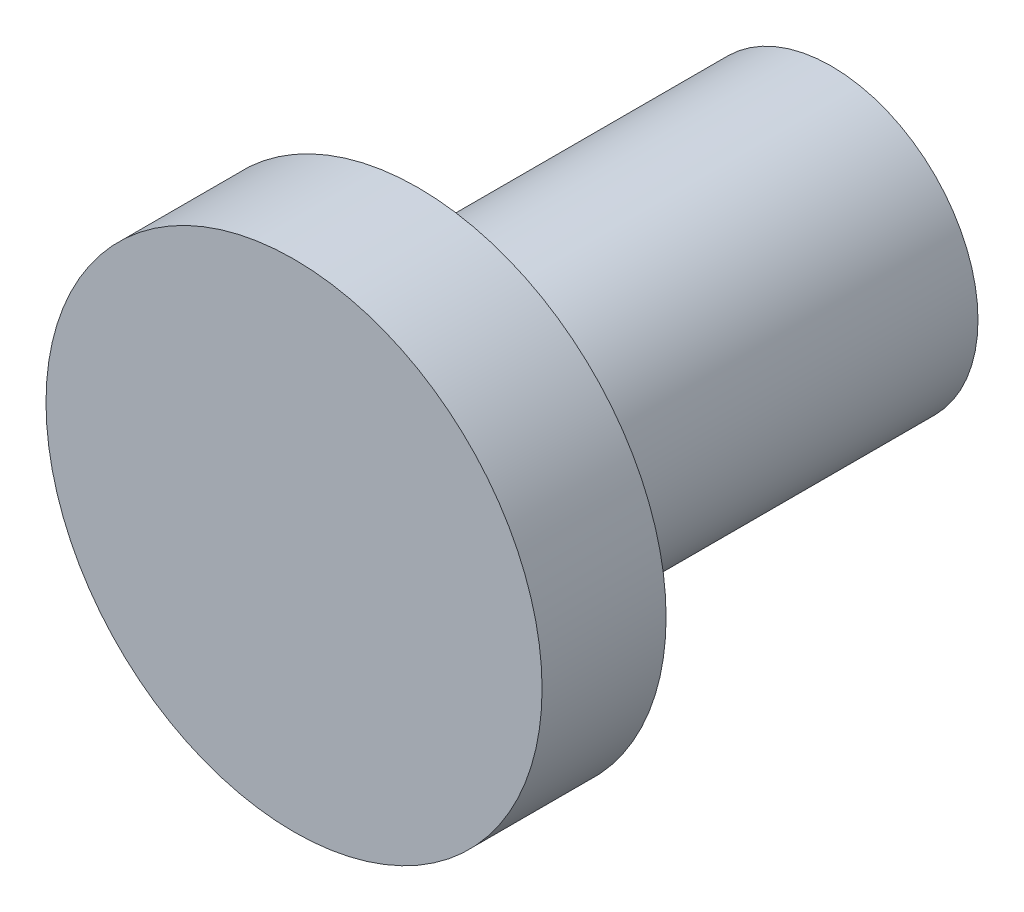
ISO-10303-21;
HEADER;
FILE_DESCRIPTION(('STEP AP214'),'2;1');
FILE_NAME('part.step','',(''),(''),'','','');
FILE_SCHEMA(('AUTOMOTIVE_DESIGN { 1 0 10303 214 1 1 1 1 }'));
ENDSEC;
DATA;
#1=APPLICATION_CONTEXT('core data for automotive mechanical design processes');
#2=APPLICATION_PROTOCOL_DEFINITION('international standard','automotive_design',2000,#1);
#3=PRODUCT_CONTEXT('',#1,'mechanical');
#4=PRODUCT('Part','Part','',(#3));
#5=PRODUCT_RELATED_PRODUCT_CATEGORY('part','',(#4));
#6=PRODUCT_DEFINITION_FORMATION('','',#4);
#7=PRODUCT_DEFINITION_CONTEXT('part definition',#1,'design');
#8=PRODUCT_DEFINITION('design','',#6,#7);
#9=PRODUCT_DEFINITION_SHAPE('','',#8);
#10=(LENGTH_UNIT() NAMED_UNIT(*) SI_UNIT(.MILLI.,.METRE.));
#11=(NAMED_UNIT(*) PLANE_ANGLE_UNIT() SI_UNIT($,.RADIAN.));
#12=(NAMED_UNIT(*) SI_UNIT($,.STERADIAN.) SOLID_ANGLE_UNIT());
#13=UNCERTAINTY_MEASURE_WITH_UNIT(LENGTH_MEASURE(1.E-05),#10,'distance_accuracy_value','');
#14=(GEOMETRIC_REPRESENTATION_CONTEXT(3) GLOBAL_UNCERTAINTY_ASSIGNED_CONTEXT((#13)) GLOBAL_UNIT_ASSIGNED_CONTEXT((#10,
#11,#12)) REPRESENTATION_CONTEXT('',''));
#15=CARTESIAN_POINT('',(0.,0.,0.));
#16=DIRECTION('',(0.,0.,1.));
#17=DIRECTION('',(1.,0.,0.));
#18=AXIS2_PLACEMENT_3D('',#15,#16,#17);
#19=CARTESIAN_POINT('',(389.255,317.5,-169.343834653373));
#20=DIRECTION('',(0.,0.,-1.));
#21=DIRECTION('',(-1.,0.,0.));
#22=AXIS2_PLACEMENT_3D('',#19,#20,#21);
#23=CYLINDRICAL_SURFACE('',#22,22.5099586096639);
#24=CARTESIAN_POINT('',(389.255,317.5,-169.343834653373));
#25=DIRECTION('',(0.,0.,1.));
#26=DIRECTION('',(1.,0.,0.));
#27=AXIS2_PLACEMENT_3D('',#24,#25,#26);
#28=CIRCLE('',#27,22.5099586096639);
#29=CARTESIAN_POINT('',(411.764958609664,317.5,-169.343834653373));
#30=VERTEX_POINT('',#29);
#31=EDGE_CURVE('E10',#30,#30,#28,.T.);
#32=ORIENTED_EDGE('',*,*,#31,.F.);
#33=EDGE_LOOP('',(#32));
#34=FACE_BOUND('',#33,.T.);
#35=CARTESIAN_POINT('',(389.255,317.5,-232.843834653373));
#36=DIRECTION('',(0.,0.,1.));
#37=DIRECTION('',(1.,0.,0.));
#38=AXIS2_PLACEMENT_3D('',#35,#36,#37);
#39=CIRCLE('',#38,22.5099586096639);
#40=CARTESIAN_POINT('',(411.764958609664,317.5,-232.843834653373));
#41=VERTEX_POINT('',#40);
#42=EDGE_CURVE('E35',#41,#41,#39,.T.);
#43=ORIENTED_EDGE('',*,*,#42,.T.);
#44=EDGE_LOOP('',(#43));
#45=FACE_BOUND('',#44,.T.);
#46=ADVANCED_FACE('F32',(#34,#45),#23,.T.);
#47=CARTESIAN_POINT('',(389.255,317.5,-232.843834653373));
#48=DIRECTION('',(0.,0.,1.));
#49=DIRECTION('',(1.,0.,0.));
#50=AXIS2_PLACEMENT_3D('',#47,#48,#49);
#51=PLANE('',#50);
#52=ORIENTED_EDGE('',*,*,#42,.F.);
#53=EDGE_LOOP('',(#52));
#54=FACE_BOUND('',#53,.T.);
#55=ADVANCED_FACE('F55',(#54),#51,.F.);
#56=CARTESIAN_POINT('',(389.255,317.5,-150.293834653373));
#57=DIRECTION('',(0.,0.,-1.));
#58=DIRECTION('',(-1.,0.,0.));
#59=AXIS2_PLACEMENT_3D('',#56,#57,#58);
#60=CYLINDRICAL_SURFACE('',#59,38.1);
#61=CARTESIAN_POINT('',(389.255,317.5,-150.293834653373));
#62=DIRECTION('',(0.,0.,1.));
#63=DIRECTION('',(1.,0.,0.));
#64=AXIS2_PLACEMENT_3D('',#61,#62,#63);
#65=CIRCLE('',#64,38.1);
#66=CARTESIAN_POINT('',(351.155,317.5,-150.293834653373));
#67=VERTEX_POINT('',#66);
#68=EDGE_CURVE('E42',#67,#67,#65,.T.);
#69=CARTESIAN_POINT('',(389.255,317.5,-169.343834653373));
#70=DIRECTION('',(0.,0.,1.));
#71=DIRECTION('',(1.,0.,0.));
#72=AXIS2_PLACEMENT_3D('',#69,#70,#71);
#73=CIRCLE('',#72,38.1);
#74=CARTESIAN_POINT('',(351.155,317.5,-169.343834653373));
#75=VERTEX_POINT('',#74);
#76=EDGE_CURVE('E44',#75,#75,#73,.T.);
#77=CARTESIAN_POINT('',(351.155,317.5,-150.293834653373));
#78=CARTESIAN_POINT('',(351.155,317.5,-150.492272153373));
#79=CARTESIAN_POINT('',(351.155,317.5,-150.690709653373));
#80=CARTESIAN_POINT('',(351.155,317.5,-151.087584653373));
#81=CARTESIAN_POINT('',(351.155,317.5,-151.286022153373));
#82=CARTESIAN_POINT('',(351.155,317.5,-151.682897153373));
#83=CARTESIAN_POINT('',(351.155,317.5,-151.881334653373));
#84=CARTESIAN_POINT('',(351.155,317.5,-152.278209653373));
#85=CARTESIAN_POINT('',(351.155,317.5,-152.476647153373));
#86=CARTESIAN_POINT('',(351.155,317.5,-152.873522153373));
#87=CARTESIAN_POINT('',(351.155,317.5,-153.071959653373));
#88=CARTESIAN_POINT('',(351.155,317.5,-153.468834653373));
#89=CARTESIAN_POINT('',(351.155,317.5,-153.667272153373));
#90=CARTESIAN_POINT('',(351.155,317.5,-154.064147153373));
#91=CARTESIAN_POINT('',(351.155,317.5,-154.262584653373));
#92=CARTESIAN_POINT('',(351.155,317.5,-154.659459653373));
#93=CARTESIAN_POINT('',(351.155,317.5,-154.857897153373));
#94=CARTESIAN_POINT('',(351.155,317.5,-155.254772153373));
#95=CARTESIAN_POINT('',(351.155,317.5,-155.453209653373));
#96=CARTESIAN_POINT('',(351.155,317.5,-155.850084653373));
#97=CARTESIAN_POINT('',(351.155,317.5,-156.048522153373));
#98=CARTESIAN_POINT('',(351.155,317.5,-156.445397153373));
#99=CARTESIAN_POINT('',(351.155,317.5,-156.643834653373));
#100=CARTESIAN_POINT('',(351.155,317.5,-157.040709653373));
#101=CARTESIAN_POINT('',(351.155,317.5,-157.239147153373));
#102=CARTESIAN_POINT('',(351.155,317.5,-157.636022153373));
#103=CARTESIAN_POINT('',(351.155,317.5,-157.834459653373));
#104=CARTESIAN_POINT('',(351.155,317.5,-158.231334653373));
#105=CARTESIAN_POINT('',(351.155,317.5,-158.429772153373));
#106=CARTESIAN_POINT('',(351.155,317.5,-158.826647153373));
#107=CARTESIAN_POINT('',(351.155,317.5,-159.025084653373));
#108=CARTESIAN_POINT('',(351.155,317.5,-159.421959653373));
#109=CARTESIAN_POINT('',(351.155,317.5,-159.620397153373));
#110=CARTESIAN_POINT('',(351.155,317.5,-160.017272153373));
#111=CARTESIAN_POINT('',(351.155,317.5,-160.215709653373));
#112=CARTESIAN_POINT('',(351.155,317.5,-160.612584653373));
#113=CARTESIAN_POINT('',(351.155,317.5,-160.811022153373));
#114=CARTESIAN_POINT('',(351.155,317.5,-161.207897153373));
#115=CARTESIAN_POINT('',(351.155,317.5,-161.406334653373));
#116=CARTESIAN_POINT('',(351.155,317.5,-161.803209653373));
#117=CARTESIAN_POINT('',(351.155,317.5,-162.001647153373));
#118=CARTESIAN_POINT('',(351.155,317.5,-162.398522153373));
#119=CARTESIAN_POINT('',(351.155,317.5,-162.596959653373));
#120=CARTESIAN_POINT('',(351.155,317.5,-162.993834653373));
#121=CARTESIAN_POINT('',(351.155,317.5,-163.192272153373));
#122=CARTESIAN_POINT('',(351.155,317.5,-163.589147153373));
#123=CARTESIAN_POINT('',(351.155,317.5,-163.787584653373));
#124=CARTESIAN_POINT('',(351.155,317.5,-164.184459653373));
#125=CARTESIAN_POINT('',(351.155,317.5,-164.382897153373));
#126=CARTESIAN_POINT('',(351.155,317.5,-164.779772153373));
#127=CARTESIAN_POINT('',(351.155,317.5,-164.978209653373));
#128=CARTESIAN_POINT('',(351.155,317.5,-165.375084653373));
#129=CARTESIAN_POINT('',(351.155,317.5,-165.573522153373));
#130=CARTESIAN_POINT('',(351.155,317.5,-165.970397153373));
#131=CARTESIAN_POINT('',(351.155,317.5,-166.168834653373));
#132=CARTESIAN_POINT('',(351.155,317.5,-166.565709653373));
#133=CARTESIAN_POINT('',(351.155,317.5,-166.764147153373));
#134=CARTESIAN_POINT('',(351.155,317.5,-167.161022153373));
#135=CARTESIAN_POINT('',(351.155,317.5,-167.359459653373));
#136=CARTESIAN_POINT('',(351.155,317.5,-167.756334653373));
#137=CARTESIAN_POINT('',(351.155,317.5,-167.954772153373));
#138=CARTESIAN_POINT('',(351.155,317.5,-168.351647153373));
#139=CARTESIAN_POINT('',(351.155,317.5,-168.550084653373));
#140=CARTESIAN_POINT('',(351.155,317.5,-168.946959653373));
#141=CARTESIAN_POINT('',(351.155,317.5,-169.145397153373));
#142=CARTESIAN_POINT('',(351.155,317.5,-169.343834653373));
#143=B_SPLINE_CURVE_WITH_KNOTS('',3,(#77,#78,#79,#80,#81,#82,#83,#84,#85,#86,#87,#88,#89,#90,
#91,#92,#93,#94,#95,#96,#97,#98,#99,#100,#101,#102,#103,#104,#105,#106,#107,#108,#109,#110,#111,
#112,#113,#114,#115,#116,#117,#118,#119,#120,#121,#122,#123,#124,#125,#126,#127,#128,#129,#130,
#131,#132,#133,#134,#135,#136,#137,#138,#139,#140,#141,#142),.UNSPECIFIED.,.F.,.F.,(4,2,2,2,2,2,
2,2,2,2,2,2,2,2,2,2,2,2,2,2,2,2,2,2,2,2,2,2,2,2,2,2,4),(0.,0.595312499999973,1.19062499999997,
1.78593749999997,2.38124999999997,2.97656249999997,3.57187499999997,4.16718749999997,
4.76249999999998,5.35781249999998,5.95312499999998,6.54843749999998,7.14374999999998,
7.73906249999998,8.33437499999998,8.92968749999998,9.52499999999998,10.1203125,10.715625,
11.3109375,11.90625,12.5015625,13.096875,13.6921875,14.2875,14.8828125,15.478125,16.0734375,
16.66875,17.2640625,17.859375,18.4546875,19.05),.UNSPECIFIED.);
#144=EDGE_CURVE('BSEAM52',#67,#75,#143,.T.);
#145=ORIENTED_EDGE('',*,*,#68,.F.);
#146=ORIENTED_EDGE('',*,*,#76,.T.);
#147=ORIENTED_EDGE('',*,*,#144,.T.);
#148=ORIENTED_EDGE('',*,*,#144,.F.);
#149=EDGE_LOOP('',(#145,#147,#146,#148));
#150=FACE_BOUND('',#149,.T.);
#151=ADVANCED_FACE('F52',(#150),#60,.T.);
#152=CARTESIAN_POINT('',(389.255,317.5,-150.293834653373));
#153=DIRECTION('',(0.,0.,1.));
#154=DIRECTION('',(1.,0.,0.));
#155=AXIS2_PLACEMENT_3D('',#152,#153,#154);
#156=PLANE('',#155);
#157=ORIENTED_EDGE('',*,*,#68,.T.);
#158=EDGE_LOOP('',(#157));
#159=FACE_BOUND('',#158,.T.);
#160=ADVANCED_FACE('F50',(#159),#156,.T.);
#161=CARTESIAN_POINT('',(389.255,317.5,-169.343834653373));
#162=DIRECTION('',(0.,0.,1.));
#163=DIRECTION('',(1.,0.,0.));
#164=AXIS2_PLACEMENT_3D('',#161,#162,#163);
#165=PLANE('',#164);
#166=ORIENTED_EDGE('',*,*,#31,.T.);
#167=EDGE_LOOP('',(#166));
#168=FACE_BOUND('',#167,.T.);
#169=ORIENTED_EDGE('',*,*,#76,.F.);
#170=EDGE_LOOP('',(#169));
#171=FACE_BOUND('',#170,.T.);
#172=ADVANCED_FACE('F59',(#168,#171),#165,.F.);
#173=CLOSED_SHELL('',(#46,#55,#151,#160,#172));
#174=MANIFOLD_SOLID_BREP('B2',#173);
#175=ADVANCED_BREP_SHAPE_REPRESENTATION('',(#18,#174),#14);
#176=SHAPE_DEFINITION_REPRESENTATION(#9,#175);
ENDSEC;
END-ISO-10303-21;
